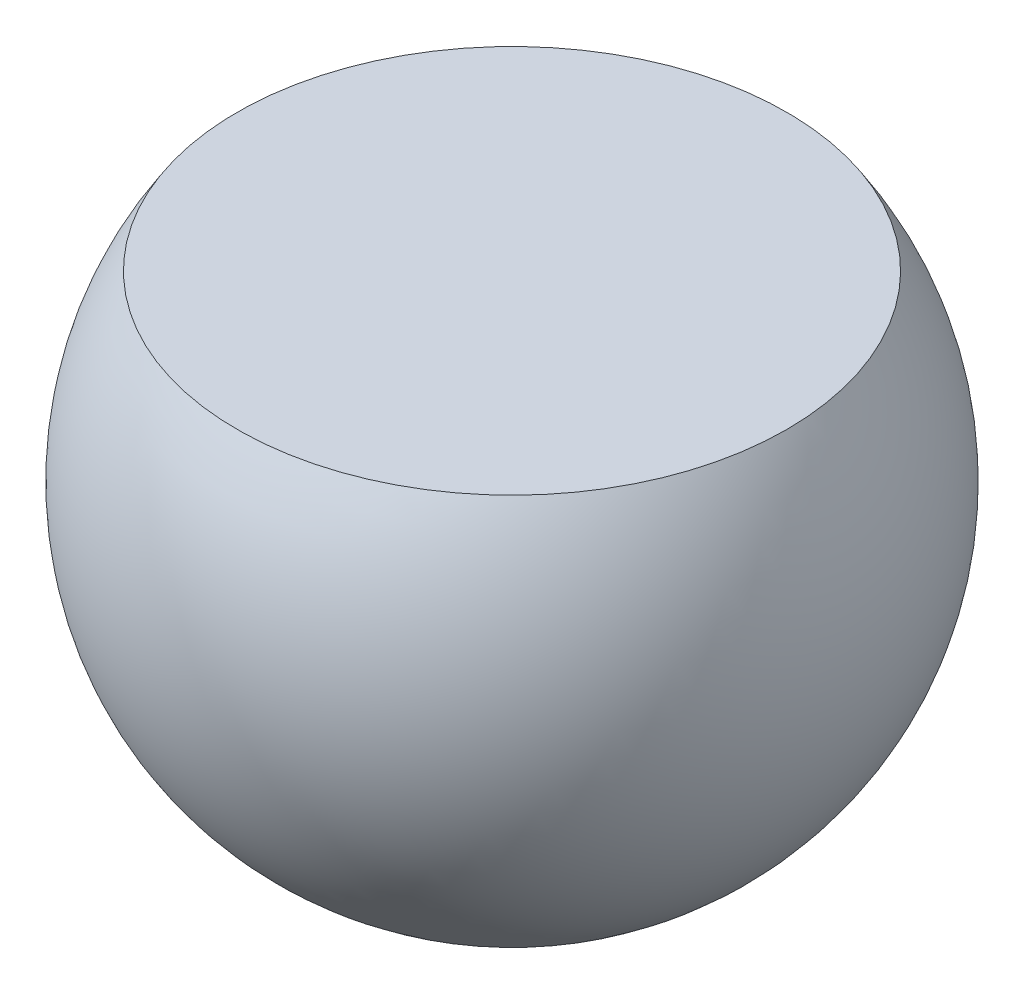
ISO-10303-21;
HEADER;
FILE_DESCRIPTION(('STEP AP214'),'2;1');
FILE_NAME('part.step','',(''),(''),'','','');
FILE_SCHEMA(('AUTOMOTIVE_DESIGN { 1 0 10303 214 1 1 1 1 }'));
ENDSEC;
DATA;
#1=APPLICATION_CONTEXT('core data for automotive mechanical design processes');
#2=APPLICATION_PROTOCOL_DEFINITION('international standard','automotive_design',2000,#1);
#3=PRODUCT_CONTEXT('',#1,'mechanical');
#4=PRODUCT('Part','Part','',(#3));
#5=PRODUCT_RELATED_PRODUCT_CATEGORY('part','',(#4));
#6=PRODUCT_DEFINITION_FORMATION('','',#4);
#7=PRODUCT_DEFINITION_CONTEXT('part definition',#1,'design');
#8=PRODUCT_DEFINITION('design','',#6,#7);
#9=PRODUCT_DEFINITION_SHAPE('','',#8);
#10=(LENGTH_UNIT() NAMED_UNIT(*) SI_UNIT(.MILLI.,.METRE.));
#11=(NAMED_UNIT(*) PLANE_ANGLE_UNIT() SI_UNIT($,.RADIAN.));
#12=(NAMED_UNIT(*) SI_UNIT($,.STERADIAN.) SOLID_ANGLE_UNIT());
#13=UNCERTAINTY_MEASURE_WITH_UNIT(LENGTH_MEASURE(1.E-05),#10,'distance_accuracy_value','');
#14=(GEOMETRIC_REPRESENTATION_CONTEXT(3) GLOBAL_UNCERTAINTY_ASSIGNED_CONTEXT((#13)) GLOBAL_UNIT_ASSIGNED_CONTEXT((#10,
#11,#12)) REPRESENTATION_CONTEXT('',''));
#15=CARTESIAN_POINT('',(0.,0.,0.));
#16=DIRECTION('',(0.,0.,1.));
#17=DIRECTION('',(1.,0.,0.));
#18=AXIS2_PLACEMENT_3D('',#15,#16,#17);
#19=CARTESIAN_POINT('',(0.,0.,0.));
#20=DIRECTION('',(0.,1.,0.));
#21=DIRECTION('',(1.,0.,0.));
#22=AXIS2_PLACEMENT_3D('',#19,#20,#21);
#23=SPHERICAL_SURFACE('',#22,152.4);
#24=CARTESIAN_POINT('',(0.,-123.19,0.));
#25=DIRECTION('',(0.,1.,0.));
#26=DIRECTION('',(0.,0.,1.));
#27=AXIS2_PLACEMENT_3D('',#24,#25,#26);
#28=CIRCLE('',#27,89.7217025027947);
#29=CARTESIAN_POINT('',(89.7217025027947,-123.19,0.));
#30=VERTEX_POINT('',#29);
#31=EDGE_CURVE('E94',#30,#30,#28,.T.);
#32=CARTESIAN_POINT('',(0.,84.2264000000001,0.));
#33=DIRECTION('',(0.,-1.,0.));
#34=DIRECTION('',(0.,0.,-1.));
#35=AXIS2_PLACEMENT_3D('',#32,#33,#34);
#36=CIRCLE('',#35,127.010525323849);
#37=CARTESIAN_POINT('',(127.010525323849,84.2264000000001,0.));
#38=VERTEX_POINT('',#37);
#39=EDGE_CURVE('E51',#38,#38,#36,.T.);
#40=CARTESIAN_POINT('',(89.7217025027947,-123.19,0.));
#41=CARTESIAN_POINT('',(90.7013703355478,-122.476492283299,0.));
#42=CARTESIAN_POINT('',(91.6725233914721,-121.751293785878,0.));
#43=CARTESIAN_POINT('',(93.5972551061415,-120.277938282163,0.));
#44=CARTESIAN_POINT('',(94.5508337648865,-119.529781275869,0.));
#45=CARTESIAN_POINT('',(96.4398718416753,-118.010931806978,0.));
#46=CARTESIAN_POINT('',(97.3753312597191,-117.240239344381,0.));
#47=CARTESIAN_POINT('',(99.2275990043137,-115.676758342769,0.));
#48=CARTESIAN_POINT('',(100.144407330864,-114.883969803753,0.));
#49=CARTESIAN_POINT('',(101.958850938813,-113.276747667024,0.));
#50=CARTESIAN_POINT('',(102.856486220211,-112.462314069311,0.));
#51=CARTESIAN_POINT('',(104.632072888969,-110.81226540358,0.));
#52=CARTESIAN_POINT('',(105.510024276329,-109.976650335563,0.));
#53=CARTESIAN_POINT('',(107.245743459662,-108.284714305707,0.));
#54=CARTESIAN_POINT('',(108.103511255635,-107.428393343868,0.));
#55=CARTESIAN_POINT('',(109.798375060164,-105.695532905666,0.));
#56=CARTESIAN_POINT('',(110.635471068719,-104.818993429304,0.));
#57=CARTESIAN_POINT('',(112.288514864035,-103.046194843898,0.));
#58=CARTESIAN_POINT('',(113.104462650795,-102.149935734853,0.));
#59=CARTESIAN_POINT('',(114.714745605659,-100.338207990656,0.));
#60=CARTESIAN_POINT('',(115.509080773762,-99.4227393555034,0.));
#61=CARTESIAN_POINT('',(117.075686395012,-97.5731135984288,0.));
#62=CARTESIAN_POINT('',(117.84795684816,-96.6389564765067,0.));
#63=CARTESIAN_POINT('',(119.369993501417,-94.7524854218856,0.));
#64=CARTESIAN_POINT('',(120.119759701527,-93.8001714891865,0.));
#65=CARTESIAN_POINT('',(121.596361118913,-91.8779288229365,0.));
#66=CARTESIAN_POINT('',(122.323196336189,-90.9080000893855,0.));
#67=CARTESIAN_POINT('',(123.753522109297,-88.951079856836,0.));
#68=CARTESIAN_POINT('',(124.457012665129,-87.9640883578374,0.));
#69=CARTESIAN_POINT('',(125.840248723362,-85.973604341076,0.));
#70=CARTESIAN_POINT('',(126.519994225763,-84.9701118233133,0.));
#71=CARTESIAN_POINT('',(127.855353299656,-82.9471969072703,0.));
#72=CARTESIAN_POINT('',(128.510966871149,-81.9277745089901,0.));
#73=CARTESIAN_POINT('',(129.797688940447,-79.873580036658,0.));
#74=CARTESIAN_POINT('',(130.428797438253,-78.8388079626061,0.));
#75=CARTESIAN_POINT('',(131.666150164474,-76.7545030797516,0.));
#76=CARTESIAN_POINT('',(132.27239439289,-75.7049702709489,0.));
#77=CARTESIAN_POINT('',(133.459673536138,-73.5917412606934,0.));
#78=CARTESIAN_POINT('',(134.040708450971,-72.5280450592404,0.));
#79=CARTESIAN_POINT('',(135.177238270754,-70.387094666886,0.));
#80=CARTESIAN_POINT('',(135.732733175705,-69.3098404759846,0.));
#81=CARTESIAN_POINT('',(136.817866815532,-67.1423872244715,0.));
#82=CARTESIAN_POINT('',(137.347505550408,-66.0521881638599,0.));
#83=CARTESIAN_POINT('',(138.380625405949,-63.8594656602434,0.));
#84=CARTESIAN_POINT('',(138.884106526613,-62.7569422172385,0.));
#85=CARTESIAN_POINT('',(139.864624597207,-60.5401984505806,0.));
#86=CARTESIAN_POINT('',(140.341661547138,-59.4259781269275,0.));
#87=CARTESIAN_POINT('',(141.269019770457,-57.1864747580036,0.));
#88=CARTESIAN_POINT('',(141.719341043845,-56.0611917127327,0.));
#89=CARTESIAN_POINT('',(142.593011613512,-53.8002033559567,0.));
#90=CARTESIAN_POINT('',(143.01636090979,-52.6644980444515,0.));
#91=CARTESIAN_POINT('',(143.835846575782,-50.3833115424285,0.));
#92=CARTESIAN_POINT('',(144.231982945496,-49.2378303519106,0.));
#93=CARTESIAN_POINT('',(144.996817297155,-46.9377440430296,0.));
#94=CARTESIAN_POINT('',(145.3655152791,-45.7831389246665,0.));
#95=CARTESIAN_POINT('',(146.075263010587,-43.4654619041508,0.));
#96=CARTESIAN_POINT('',(146.41631276013,-42.3023900019981,0.));
#97=CARTESIAN_POINT('',(147.070569918186,-39.9684413768327,0.));
#98=CARTESIAN_POINT('',(147.383777326699,-38.7975646538201,0.));
#99=CARTESIAN_POINT('',(147.982171540549,-36.4486727919818,0.));
#100=CARTESIAN_POINT('',(148.267358345886,-35.2706576531563,0.));
#101=CARTESIAN_POINT('',(148.809549039176,-32.9081594275721,0.));
#102=CARTESIAN_POINT('',(149.06655292713,-31.7236763408136,0.));
#103=CARTESIAN_POINT('',(149.552231511768,-29.348916368479,0.));
#104=CARTESIAN_POINT('',(149.780906208453,-28.158639482903,0.));
#105=CARTESIAN_POINT('',(150.20979626024,-25.7729693595925,0.));
#106=CARTESIAN_POINT('',(150.410011615343,-24.577576121858,0.));
#107=CARTESIAN_POINT('',(150.781869031302,-22.1823536528637,0.));
#108=CARTESIAN_POINT('',(150.953511092158,-20.9825244216039,0.));
#109=CARTESIAN_POINT('',(151.268124229461,-18.57911284894,0.));
#110=CARTESIAN_POINT('',(151.411095305909,-17.3755305075359,0.));
#111=CARTESIAN_POINT('',(151.66828510234,-14.965297734049,0.));
#112=CARTESIAN_POINT('',(151.782503822323,-13.7586473019661,0.));
#113=CARTESIAN_POINT('',(151.982123898186,-11.3429651127923,0.));
#114=CARTESIAN_POINT('',(152.067525254065,-10.1339333557014,0.));
#115=CARTESIAN_POINT('',(152.209461995497,-7.71417663751455,0.));
#116=CARTESIAN_POINT('',(152.26599738105,-6.50345167641862,0.));
#117=CARTESIAN_POINT('',(152.350170004688,-4.08099763491263,0.));
#118=CARTESIAN_POINT('',(152.377807242773,-2.86926855450258,0.));
#119=CARTESIAN_POINT('',(152.404167841727,-0.445495930554217,0.));
#120=CARTESIAN_POINT('',(152.402891202597,0.766547612984087,0.));
#121=CARTESIAN_POINT('',(152.37142477372,3.19025932802623,0.));
#122=CARTESIAN_POINT('',(152.341234983974,4.40192749953006,0.));
#123=CARTESIAN_POINT('',(152.251959436399,6.82419884898372,0.));
#124=CARTESIAN_POINT('',(152.192873678571,8.03480202693354,0.));
#125=CARTESIAN_POINT('',(152.045839823519,10.4542543739012,0.));
#126=CARTESIAN_POINT('',(151.957891726296,11.6631035429191,0.));
#127=CARTESIAN_POINT('',(151.753183248156,14.0783598549398,0.));
#128=CARTESIAN_POINT('',(151.636422867239,15.2847669979428,0.));
#129=CARTESIAN_POINT('',(151.374156275939,17.6944526307311,0.));
#130=CARTESIAN_POINT('',(151.228650065555,18.8977311205165,0.));
#131=CARTESIAN_POINT('',(150.908974630251,21.3004746003416,0.));
#132=CARTESIAN_POINT('',(150.73480540533,22.4999395903812,0.));
#133=CARTESIAN_POINT('',(150.357903069448,24.8943733946418,0.));
#134=CARTESIAN_POINT('',(150.155169958488,26.0893422088627,0.));
#135=CARTESIAN_POINT('',(149.721255236174,28.4741035444135,0.));
#136=CARTESIAN_POINT('',(149.49007362482,29.6638960657434,0.));
#137=CARTESIAN_POINT('',(148.999393478846,32.0376276445292,0.));
#138=CARTESIAN_POINT('',(148.739894944225,33.2215667019852,0.));
#139=CARTESIAN_POINT('',(148.192728645429,35.5829175135423,0.));
#140=CARTESIAN_POINT('',(147.905060881255,36.7603292676435,0.));
#141=CARTESIAN_POINT('',(147.3017198496,39.1079553480276,0.));
#142=CARTESIAN_POINT('',(146.986046582119,40.2781696743106,0.));
#143=CARTESIAN_POINT('',(146.326874209441,42.6107348710151,0.));
#144=CARTESIAN_POINT('',(145.983375104244,43.7730857414366,0.));
#145=CARTESIAN_POINT('',(145.268746558813,46.0892624738629,0.));
#146=CARTESIAN_POINT('',(144.897617118579,47.2430883358678,0.));
#147=CARTESIAN_POINT('',(144.127939131578,49.5415583509232,0.));
#148=CARTESIAN_POINT('',(143.729390584812,50.6862025039736,0.));
#149=CARTESIAN_POINT('',(142.90510121882,52.9656576263395,0.));
#150=CARTESIAN_POINT('',(142.479360399595,54.100468595655,0.));
#151=CARTESIAN_POINT('',(141.600928799357,56.359611472394,0.));
#152=CARTESIAN_POINT('',(141.148238018344,57.4839433798175,0.));
#153=CARTESIAN_POINT('',(140.216164143411,59.7214882185459,0.));
#154=CARTESIAN_POINT('',(139.736781049491,60.8347011498507,0.));
#155=CARTESIAN_POINT('',(138.751595390953,63.0493744513548,0.));
#156=CARTESIAN_POINT('',(138.245792826335,64.150834821554,0.));
#157=CARTESIAN_POINT('',(137.208056100104,66.3413761015917,0.));
#158=CARTESIAN_POINT('',(136.676121938492,67.4304570114302,0.));
#159=CARTESIAN_POINT('',(135.58642478403,69.5956195293735,0.));
#160=CARTESIAN_POINT('',(135.02866179118,70.6717011374783,0.));
#161=CARTESIAN_POINT('',(133.887624368693,72.810252563959,0.));
#162=CARTESIAN_POINT('',(133.304349939057,73.872722382335,0.));
#163=CARTESIAN_POINT('',(132.112621825232,75.9834456571363,0.));
#164=CARTESIAN_POINT('',(131.504168141043,77.0316991135616,0.));
#165=CARTESIAN_POINT('',(130.262427031192,79.113392554204,0.));
#166=CARTESIAN_POINT('',(129.629139605531,80.1468325384211,0.));
#167=CARTESIAN_POINT('',(128.338094391764,82.1983127040069,0.));
#168=CARTESIAN_POINT('',(127.68033660366,83.2163528853756,0.));
#169=CARTESIAN_POINT('',(127.010525323849,84.2264000000001,0.));
#170=B_SPLINE_CURVE_WITH_KNOTS('',3,(#40,#41,#42,#43,#44,#45,#46,#47,#48,#49,#50,#51,#52,#53,
#54,#55,#56,#57,#58,#59,#60,#61,#62,#63,#64,#65,#66,#67,#68,#69,#70,#71,#72,#73,#74,#75,#76,#77,
#78,#79,#80,#81,#82,#83,#84,#85,#86,#87,#88,#89,#90,#91,#92,#93,#94,#95,#96,#97,#98,#99,#100,
#101,#102,#103,#104,#105,#106,#107,#108,#109,#110,#111,#112,#113,#114,#115,#116,#117,#118,#119,
#120,#121,#122,#123,#124,#125,#126,#127,#128,#129,#130,#131,#132,#133,#134,#135,#136,#137,#138,
#139,#140,#141,#142,#143,#144,#145,#146,#147,#148,#149,#150,#151,#152,#153,#154,#155,#156,#157,
#158,#159,#160,#161,#162,#163,#164,#165,#166,#167,#168,#169),.UNSPECIFIED.,.F.,.F.,(4,2,2,2,2,2,
2,2,2,2,2,2,2,2,2,2,2,2,2,2,2,2,2,2,2,2,2,2,2,2,2,2,2,2,2,2,2,2,2,2,2,2,2,2,2,2,2,2,2,2,2,2,2,2,
2,2,2,2,2,2,2,2,2,2,4),(0.,3.63578772985764,7.27157545971531,10.907363189573,14.5431509194306,
18.1789386492883,21.8147263791459,25.4505141090036,29.0863018388612,32.7220895687189,
36.3578772985765,39.9936650284342,43.6294527582918,47.2652404881495,50.9010282180071,
54.5368159478648,58.1726036777224,61.8083914075801,65.4441791374377,69.0799668672954,
72.715754597153,76.3515423270107,79.9873300568683,83.623117786726,87.2589055165836,
90.8946932464413,94.5304809762989,98.1662687061566,101.802056436014,105.437844165872,
109.07363189573,112.709419625587,116.345207355445,119.980995085302,123.61678281516,
127.252570545018,130.888358274875,134.524146004733,138.159933734591,141.795721464448,
145.431509194306,149.067296924164,152.703084654021,156.338872383879,159.974660113737,
163.610447843594,167.246235573452,170.88202330331,174.517811033167,178.153598763025,
181.789386492883,185.42517422274,189.060961952598,192.696749682456,196.332537412313,
199.968325142171,203.604112872028,207.239900601886,210.875688331744,214.511476061601,
218.147263791459,221.783051521317,225.418839251174,229.054626981032,232.69041471089),.UNSPECIFIED.);
#171=EDGE_CURVE('BSEAM43',#30,#38,#170,.T.);
#172=ORIENTED_EDGE('',*,*,#31,.T.);
#173=ORIENTED_EDGE('',*,*,#39,.T.);
#174=ORIENTED_EDGE('',*,*,#171,.T.);
#175=ORIENTED_EDGE('',*,*,#171,.F.);
#176=EDGE_LOOP('',(#172,#174,#173,#175));
#177=FACE_BOUND('',#176,.T.);
#178=ADVANCED_FACE('F43',(#177),#23,.T.);
#179=CARTESIAN_POINT('',(0.,84.2264000000001,0.));
#180=DIRECTION('',(0.,-1.,0.));
#181=DIRECTION('',(0.,0.,-1.));
#182=AXIS2_PLACEMENT_3D('',#179,#180,#181);
#183=PLANE('',#182);
#184=ORIENTED_EDGE('',*,*,#39,.F.);
#185=EDGE_LOOP('',(#184));
#186=FACE_BOUND('',#185,.T.);
#187=ADVANCED_FACE('F149',(#186),#183,.F.);
#188=CARTESIAN_POINT('',(0.,-123.19,0.));
#189=DIRECTION('',(0.,1.,0.));
#190=DIRECTION('',(0.,0.,1.));
#191=AXIS2_PLACEMENT_3D('',#188,#189,#190);
#192=PLANE('',#191);
#193=DIRECTION('',(-1.,0.,0.));
#194=VECTOR('',#193,1.);
#195=CARTESIAN_POINT('',(38.1,-123.19,38.1));
#196=LINE('',#195,#194);
#197=CARTESIAN_POINT('',(38.1,-123.19,38.1));
#198=VERTEX_POINT('',#197);
#199=CARTESIAN_POINT('',(-38.1,-123.19,38.1));
#200=VERTEX_POINT('',#199);
#201=EDGE_CURVE('E95',#198,#200,#196,.T.);
#202=ORIENTED_EDGE('',*,*,#201,.F.);
#203=DIRECTION('',(0.,0.,1.));
#204=VECTOR('',#203,1.);
#205=CARTESIAN_POINT('',(38.1,-123.19,-38.1));
#206=LINE('',#205,#204);
#207=CARTESIAN_POINT('',(38.1,-123.19,-38.1));
#208=VERTEX_POINT('',#207);
#209=EDGE_CURVE('E58',#208,#198,#206,.T.);
#210=ORIENTED_EDGE('',*,*,#209,.F.);
#211=DIRECTION('',(1.,0.,0.));
#212=VECTOR('',#211,1.);
#213=CARTESIAN_POINT('',(38.1,-123.19,-38.1));
#214=LINE('',#213,#212);
#215=CARTESIAN_POINT('',(-38.1,-123.19,-38.1));
#216=VERTEX_POINT('',#215);
#217=EDGE_CURVE('E11',#216,#208,#214,.T.);
#218=ORIENTED_EDGE('',*,*,#217,.F.);
#219=DIRECTION('',(0.,0.,-1.));
#220=VECTOR('',#219,1.);
#221=CARTESIAN_POINT('',(-38.1,-123.19,-38.1));
#222=LINE('',#221,#220);
#223=EDGE_CURVE('E85',#200,#216,#222,.T.);
#224=ORIENTED_EDGE('',*,*,#223,.F.);
#225=EDGE_LOOP('',(#202,#210,#218,#224));
#226=FACE_BOUND('',#225,.T.);
#227=ORIENTED_EDGE('',*,*,#31,.F.);
#228=EDGE_LOOP('',(#227));
#229=FACE_BOUND('',#228,.T.);
#230=ADVANCED_FACE('F83',(#226,#229),#192,.F.);
#231=CARTESIAN_POINT('',(0.,-114.3,0.));
#232=DIRECTION('',(0.,-1.,0.));
#233=DIRECTION('',(0.,0.,-1.));
#234=AXIS2_PLACEMENT_3D('',#231,#232,#233);
#235=PLANE('',#234);
#236=DIRECTION('',(0.,0.,-1.));
#237=VECTOR('',#236,1.);
#238=CARTESIAN_POINT('',(-38.1,-114.3,-38.1));
#239=LINE('',#238,#237);
#240=CARTESIAN_POINT('',(-38.1,-114.3,38.1));
#241=VERTEX_POINT('',#240);
#242=CARTESIAN_POINT('',(-38.1,-114.3,-38.1));
#243=VERTEX_POINT('',#242);
#244=EDGE_CURVE('E127',#241,#243,#239,.T.);
#245=ORIENTED_EDGE('',*,*,#244,.T.);
#246=DIRECTION('',(1.,0.,0.));
#247=VECTOR('',#246,1.);
#248=CARTESIAN_POINT('',(38.1,-114.3,-38.1));
#249=LINE('',#248,#247);
#250=CARTESIAN_POINT('',(38.1,-114.3,-38.1));
#251=VERTEX_POINT('',#250);
#252=EDGE_CURVE('E99',#243,#251,#249,.T.);
#253=ORIENTED_EDGE('',*,*,#252,.T.);
#254=DIRECTION('',(0.,0.,1.));
#255=VECTOR('',#254,1.);
#256=CARTESIAN_POINT('',(38.1,-114.3,-38.1));
#257=LINE('',#256,#255);
#258=CARTESIAN_POINT('',(38.1,-114.3,38.1));
#259=VERTEX_POINT('',#258);
#260=EDGE_CURVE('E110',#251,#259,#257,.T.);
#261=ORIENTED_EDGE('',*,*,#260,.T.);
#262=DIRECTION('',(-1.,0.,0.));
#263=VECTOR('',#262,1.);
#264=CARTESIAN_POINT('',(38.1,-114.3,38.1));
#265=LINE('',#264,#263);
#266=EDGE_CURVE('E103',#259,#241,#265,.T.);
#267=ORIENTED_EDGE('',*,*,#266,.T.);
#268=EDGE_LOOP('',(#245,#253,#261,#267));
#269=FACE_BOUND('',#268,.T.);
#270=ADVANCED_FACE('F141',(#269),#235,.T.);
#271=CARTESIAN_POINT('',(38.1,-114.3,-38.1));
#272=DIRECTION('',(0.,0.,-1.));
#273=DIRECTION('',(-1.,0.,0.));
#274=AXIS2_PLACEMENT_3D('',#271,#272,#273);
#275=PLANE('',#274);
#276=DIRECTION('',(0.,-1.,0.));
#277=VECTOR('',#276,1.);
#278=CARTESIAN_POINT('',(-38.1,-114.3,-38.1));
#279=LINE('',#278,#277);
#280=EDGE_CURVE('E91',#243,#216,#279,.T.);
#281=ORIENTED_EDGE('',*,*,#280,.T.);
#282=ORIENTED_EDGE('',*,*,#217,.T.);
#283=DIRECTION('',(0.,-1.,0.));
#284=VECTOR('',#283,1.);
#285=CARTESIAN_POINT('',(38.1,-114.3,-38.1));
#286=LINE('',#285,#284);
#287=EDGE_CURVE('E102',#251,#208,#286,.T.);
#288=ORIENTED_EDGE('',*,*,#287,.F.);
#289=ORIENTED_EDGE('',*,*,#252,.F.);
#290=EDGE_LOOP('',(#281,#282,#288,#289));
#291=FACE_BOUND('',#290,.T.);
#292=ADVANCED_FACE('F97',(#291),#275,.F.);
#293=CARTESIAN_POINT('',(38.1,-114.3,-38.1));
#294=DIRECTION('',(1.,0.,0.));
#295=DIRECTION('',(0.,0.,-1.));
#296=AXIS2_PLACEMENT_3D('',#293,#294,#295);
#297=PLANE('',#296);
#298=ORIENTED_EDGE('',*,*,#287,.T.);
#299=ORIENTED_EDGE('',*,*,#209,.T.);
#300=DIRECTION('',(0.,-1.,0.));
#301=VECTOR('',#300,1.);
#302=CARTESIAN_POINT('',(38.1,-114.3,38.1));
#303=LINE('',#302,#301);
#304=EDGE_CURVE('E107',#259,#198,#303,.T.);
#305=ORIENTED_EDGE('',*,*,#304,.F.);
#306=ORIENTED_EDGE('',*,*,#260,.F.);
#307=EDGE_LOOP('',(#298,#299,#305,#306));
#308=FACE_BOUND('',#307,.T.);
#309=ADVANCED_FACE('F137',(#308),#297,.F.);
#310=CARTESIAN_POINT('',(38.1,-114.3,38.1));
#311=DIRECTION('',(0.,0.,1.));
#312=DIRECTION('',(1.,0.,0.));
#313=AXIS2_PLACEMENT_3D('',#310,#311,#312);
#314=PLANE('',#313);
#315=ORIENTED_EDGE('',*,*,#304,.T.);
#316=ORIENTED_EDGE('',*,*,#201,.T.);
#317=DIRECTION('',(0.,-1.,0.));
#318=VECTOR('',#317,1.);
#319=CARTESIAN_POINT('',(-38.1,-114.3,38.1));
#320=LINE('',#319,#318);
#321=EDGE_CURVE('E65',#241,#200,#320,.T.);
#322=ORIENTED_EDGE('',*,*,#321,.F.);
#323=ORIENTED_EDGE('',*,*,#266,.F.);
#324=EDGE_LOOP('',(#315,#316,#322,#323));
#325=FACE_BOUND('',#324,.T.);
#326=ADVANCED_FACE('F139',(#325),#314,.F.);
#327=CARTESIAN_POINT('',(-38.1,-114.3,-38.1));
#328=DIRECTION('',(-1.,0.,0.));
#329=DIRECTION('',(0.,0.,1.));
#330=AXIS2_PLACEMENT_3D('',#327,#328,#329);
#331=PLANE('',#330);
#332=ORIENTED_EDGE('',*,*,#321,.T.);
#333=ORIENTED_EDGE('',*,*,#223,.T.);
#334=ORIENTED_EDGE('',*,*,#280,.F.);
#335=ORIENTED_EDGE('',*,*,#244,.F.);
#336=EDGE_LOOP('',(#332,#333,#334,#335));
#337=FACE_BOUND('',#336,.T.);
#338=ADVANCED_FACE('F90',(#337),#331,.F.);
#339=CLOSED_SHELL('',(#178,#187,#230,#270,#292,#309,#326,#338));
#340=MANIFOLD_SOLID_BREP('B2',#339);
#341=ADVANCED_BREP_SHAPE_REPRESENTATION('',(#18,#340),#14);
#342=SHAPE_DEFINITION_REPRESENTATION(#9,#341);
ENDSEC;
END-ISO-10303-21;
